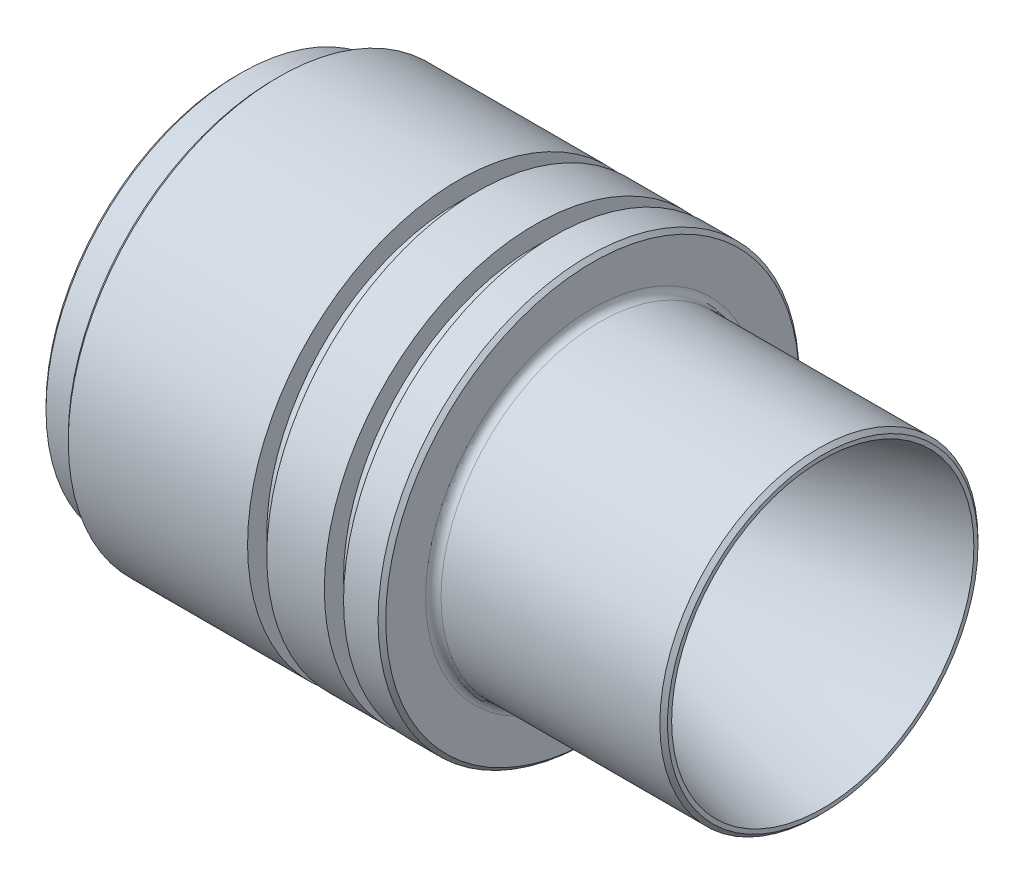
ISO-10303-21;
HEADER;
FILE_DESCRIPTION(('STEP AP214'),'2;1');
FILE_NAME('part.step','',(''),(''),'','','');
FILE_SCHEMA(('AUTOMOTIVE_DESIGN { 1 0 10303 214 1 1 1 1 }'));
ENDSEC;
DATA;
#1=APPLICATION_CONTEXT('core data for automotive mechanical design processes');
#2=APPLICATION_PROTOCOL_DEFINITION('international standard','automotive_design',2000,#1);
#3=PRODUCT_CONTEXT('',#1,'mechanical');
#4=PRODUCT('Part','Part','',(#3));
#5=PRODUCT_RELATED_PRODUCT_CATEGORY('part','',(#4));
#6=PRODUCT_DEFINITION_FORMATION('','',#4);
#7=PRODUCT_DEFINITION_CONTEXT('part definition',#1,'design');
#8=PRODUCT_DEFINITION('design','',#6,#7);
#9=PRODUCT_DEFINITION_SHAPE('','',#8);
#10=(LENGTH_UNIT() NAMED_UNIT(*) SI_UNIT(.MILLI.,.METRE.));
#11=(NAMED_UNIT(*) PLANE_ANGLE_UNIT() SI_UNIT($,.RADIAN.));
#12=(NAMED_UNIT(*) SI_UNIT($,.STERADIAN.) SOLID_ANGLE_UNIT());
#13=UNCERTAINTY_MEASURE_WITH_UNIT(LENGTH_MEASURE(1.E-05),#10,'distance_accuracy_value','');
#14=(GEOMETRIC_REPRESENTATION_CONTEXT(3) GLOBAL_UNCERTAINTY_ASSIGNED_CONTEXT((#13)) GLOBAL_UNIT_ASSIGNED_CONTEXT((#10,
#11,#12)) REPRESENTATION_CONTEXT('',''));
#15=CARTESIAN_POINT('',(0.,0.,0.));
#16=DIRECTION('',(0.,0.,1.));
#17=DIRECTION('',(1.,0.,0.));
#18=AXIS2_PLACEMENT_3D('',#15,#16,#17);
#19=CARTESIAN_POINT('',(48444.9309471186,-998987.534881036,4.14945855453652E-12));
#20=CARTESIAN_POINT('',(-29010.8121626959,999604.894565104,5.27355936696949E-13));
#21=CARTESIAN_POINT('',(9933.79310329496,-1000108.68715124,2.35228503342455E-12));
#22=B_SPLINE_CURVE_WITH_KNOTS('',2,(#19,#20,#21),.UNSPECIFIED.,.F.,.F.,(3,3),(0.,1.),.UNSPECIFIED.);
#23=CARTESIAN_POINT('',(-88.9899999999999,0.,0.));
#24=DIRECTION('',(-1.,0.,0.));
#25=AXIS1_PLACEMENT('',#23,#24);
#26=SURFACE_OF_REVOLUTION('',#22,#25);
#27=CARTESIAN_POINT('',(9.77794269744381,0.,0.));
#28=DIRECTION('',(-1.,0.,0.));
#29=DIRECTION('',(0.,0.,1.));
#30=AXIS2_PLACEMENT_3D('',#27,#28,#29);
#31=CIRCLE('',#30,8.80937168716728);
#32=CARTESIAN_POINT('',(9.77794269744381,0.,8.80937168716729));
#33=VERTEX_POINT('',#32);
#34=EDGE_CURVE('E112',#33,#33,#31,.T.);
#35=ORIENTED_EDGE('',*,*,#34,.T.);
#36=EDGE_LOOP('',(#35));
#37=FACE_BOUND('',#36,.T.);
#38=CARTESIAN_POINT('',(58.8685780406379,0.,0.));
#39=DIRECTION('',(-1.,0.,0.));
#40=DIRECTION('',(0.,0.,1.));
#41=AXIS2_PLACEMENT_3D('',#38,#39,#40);
#42=CIRCLE('',#41,25.);
#43=CARTESIAN_POINT('',(58.8685780406379,0.,25.));
#44=VERTEX_POINT('',#43);
#45=EDGE_CURVE('E70',#44,#44,#42,.T.);
#46=ORIENTED_EDGE('',*,*,#45,.F.);
#47=EDGE_LOOP('',(#46));
#48=FACE_BOUND('',#47,.T.);
#49=ADVANCED_FACE('F32',(#37,#48),#26,.F.);
#50=CARTESIAN_POINT('',(58.8685780406379,0.,0.));
#51=DIRECTION('',(1.,0.,0.));
#52=DIRECTION('',(0.,0.,-1.));
#53=AXIS2_PLACEMENT_3D('',#50,#51,#52);
#54=PLANE('',#53);
#55=CARTESIAN_POINT('',(58.8685780406379,0.,0.));
#56=DIRECTION('',(1.,0.,0.));
#57=DIRECTION('',(0.,0.,-1.));
#58=AXIS2_PLACEMENT_3D('',#55,#56,#57);
#59=CIRCLE('',#58,25.6794);
#60=CARTESIAN_POINT('',(58.8685780406379,0.,-25.6794));
#61=VERTEX_POINT('',#60);
#62=EDGE_CURVE('E64',#61,#61,#59,.T.);
#63=ORIENTED_EDGE('',*,*,#62,.T.);
#64=EDGE_LOOP('',(#63));
#65=FACE_BOUND('',#64,.T.);
#66=ORIENTED_EDGE('',*,*,#45,.T.);
#67=EDGE_LOOP('',(#66));
#68=FACE_BOUND('',#67,.T.);
#69=ADVANCED_FACE('F125',(#65,#68),#54,.T.);
#70=CARTESIAN_POINT('',(-88.9899999999999,0.,0.));
#71=DIRECTION('',(-1.,0.,0.));
#72=DIRECTION('',(0.,0.,1.));
#73=AXIS2_PLACEMENT_3D('',#70,#71,#72);
#74=CYLINDRICAL_SURFACE('',#73,26.3144);
#75=CARTESIAN_POINT('',(22.038578040638,0.,0.));
#76=DIRECTION('',(1.,0.,0.));
#77=DIRECTION('',(0.,0.,-1.));
#78=AXIS2_PLACEMENT_3D('',#75,#76,#77);
#79=CIRCLE('',#78,26.3144);
#80=CARTESIAN_POINT('',(22.038578040638,0.,-26.3144));
#81=VERTEX_POINT('',#80);
#82=EDGE_CURVE('E10',#81,#81,#79,.T.);
#83=ORIENTED_EDGE('',*,*,#82,.T.);
#84=EDGE_LOOP('',(#83));
#85=FACE_BOUND('',#84,.T.);
#86=CARTESIAN_POINT('',(58.233578040638,0.,0.));
#87=DIRECTION('',(1.,0.,0.));
#88=DIRECTION('',(0.,0.,-1.));
#89=AXIS2_PLACEMENT_3D('',#86,#87,#88);
#90=CIRCLE('',#89,26.3144);
#91=CARTESIAN_POINT('',(58.233578040638,0.,-26.3144));
#92=VERTEX_POINT('',#91);
#93=EDGE_CURVE('E67',#92,#92,#90,.F.);
#94=ORIENTED_EDGE('',*,*,#93,.T.);
#95=EDGE_LOOP('',(#94));
#96=FACE_BOUND('',#95,.T.);
#97=ADVANCED_FACE('F217',(#85,#96),#74,.T.);
#98=CARTESIAN_POINT('',(20.7685780406379,0.,0.));
#99=DIRECTION('',(1.,0.,0.));
#100=DIRECTION('',(0.,0.,-1.));
#101=AXIS2_PLACEMENT_3D('',#98,#99,#100);
#102=PLANE('',#101);
#103=CARTESIAN_POINT('',(20.7685780406379,0.,0.));
#104=DIRECTION('',(1.,0.,0.));
#105=DIRECTION('',(0.,0.,-1.));
#106=AXIS2_PLACEMENT_3D('',#103,#104,#105);
#107=CIRCLE('',#106,27.5844);
#108=CARTESIAN_POINT('',(20.7685780406379,0.,-27.5844));
#109=VERTEX_POINT('',#108);
#110=EDGE_CURVE('E39',#109,#109,#107,.F.);
#111=ORIENTED_EDGE('',*,*,#110,.T.);
#112=EDGE_LOOP('',(#111));
#113=FACE_BOUND('',#112,.T.);
#114=CARTESIAN_POINT('',(20.7685780406379,0.,0.));
#115=DIRECTION('',(1.,0.,0.));
#116=DIRECTION('',(0.,0.,-1.));
#117=AXIS2_PLACEMENT_3D('',#114,#115,#116);
#118=CIRCLE('',#117,34.1884);
#119=CARTESIAN_POINT('',(20.7685780406379,0.,-34.1884));
#120=VERTEX_POINT('',#119);
#121=EDGE_CURVE('E58',#120,#120,#118,.T.);
#122=ORIENTED_EDGE('',*,*,#121,.T.);
#123=EDGE_LOOP('',(#122));
#124=FACE_BOUND('',#123,.T.);
#125=ADVANCED_FACE('F214',(#113,#124),#102,.T.);
#126=CARTESIAN_POINT('',(-88.9899999999999,0.,0.));
#127=DIRECTION('',(-1.,0.,0.));
#128=DIRECTION('',(0.,0.,1.));
#129=AXIS2_PLACEMENT_3D('',#126,#127,#128);
#130=CYLINDRICAL_SURFACE('',#129,34.8234);
#131=CARTESIAN_POINT('',(20.133578040638,0.,0.));
#132=DIRECTION('',(1.,0.,0.));
#133=DIRECTION('',(0.,0.,-1.));
#134=AXIS2_PLACEMENT_3D('',#131,#132,#133);
#135=CIRCLE('',#134,34.8234);
#136=CARTESIAN_POINT('',(20.133578040638,0.,-34.8234));
#137=VERTEX_POINT('',#136);
#138=EDGE_CURVE('E61',#137,#137,#135,.F.);
#139=ORIENTED_EDGE('',*,*,#138,.T.);
#140=EDGE_LOOP('',(#139));
#141=FACE_BOUND('',#140,.T.);
#142=CARTESIAN_POINT('',(14.4185780406381,0.,0.));
#143=DIRECTION('',(-1.,0.,0.));
#144=DIRECTION('',(0.,0.,1.));
#145=AXIS2_PLACEMENT_3D('',#142,#143,#144);
#146=CIRCLE('',#145,34.8234);
#147=CARTESIAN_POINT('',(14.4185780406381,0.,34.8234));
#148=VERTEX_POINT('',#147);
#149=EDGE_CURVE('E73',#148,#148,#146,.T.);
#150=ORIENTED_EDGE('',*,*,#149,.F.);
#151=EDGE_LOOP('',(#150));
#152=FACE_BOUND('',#151,.T.);
#153=ADVANCED_FACE('F210',(#141,#152),#130,.T.);
#154=CARTESIAN_POINT('',(14.4185780406381,0.,0.));
#155=DIRECTION('',(-1.,0.,0.));
#156=DIRECTION('',(0.,0.,1.));
#157=AXIS2_PLACEMENT_3D('',#154,#155,#156);
#158=PLANE('',#157);
#159=ORIENTED_EDGE('',*,*,#149,.T.);
#160=EDGE_LOOP('',(#159));
#161=FACE_BOUND('',#160,.T.);
#162=CARTESIAN_POINT('',(14.4185780406381,0.,0.));
#163=DIRECTION('',(-1.,0.,0.));
#164=DIRECTION('',(0.,0.,1.));
#165=AXIS2_PLACEMENT_3D('',#162,#163,#164);
#166=CIRCLE('',#165,31.6484);
#167=CARTESIAN_POINT('',(14.4185780406381,0.,31.6484));
#168=VERTEX_POINT('',#167);
#169=EDGE_CURVE('E76',#168,#168,#166,.T.);
#170=ORIENTED_EDGE('',*,*,#169,.F.);
#171=EDGE_LOOP('',(#170));
#172=FACE_BOUND('',#171,.T.);
#173=ADVANCED_FACE('F206',(#161,#172),#158,.T.);
#174=CARTESIAN_POINT('',(-88.9899999999999,0.,0.));
#175=DIRECTION('',(-1.,0.,0.));
#176=DIRECTION('',(0.,0.,1.));
#177=AXIS2_PLACEMENT_3D('',#174,#175,#176);
#178=CYLINDRICAL_SURFACE('',#177,31.6484);
#179=ORIENTED_EDGE('',*,*,#169,.T.);
#180=EDGE_LOOP('',(#179));
#181=FACE_BOUND('',#180,.T.);
#182=CARTESIAN_POINT('',(11.2435780406379,0.,0.));
#183=DIRECTION('',(-1.,0.,0.));
#184=DIRECTION('',(0.,0.,1.));
#185=AXIS2_PLACEMENT_3D('',#182,#183,#184);
#186=CIRCLE('',#185,31.6484);
#187=CARTESIAN_POINT('',(11.2435780406379,0.,31.6484));
#188=VERTEX_POINT('',#187);
#189=EDGE_CURVE('E79',#188,#188,#186,.T.);
#190=ORIENTED_EDGE('',*,*,#189,.F.);
#191=EDGE_LOOP('',(#190));
#192=FACE_BOUND('',#191,.T.);
#193=ADVANCED_FACE('F202',(#181,#192),#178,.T.);
#194=CARTESIAN_POINT('',(11.2435780406379,0.,0.));
#195=DIRECTION('',(1.,0.,0.));
#196=DIRECTION('',(0.,0.,-1.));
#197=AXIS2_PLACEMENT_3D('',#194,#195,#196);
#198=PLANE('',#197);
#199=ORIENTED_EDGE('',*,*,#189,.T.);
#200=EDGE_LOOP('',(#199));
#201=FACE_BOUND('',#200,.T.);
#202=CARTESIAN_POINT('',(11.2435780406379,0.,0.));
#203=DIRECTION('',(-1.,0.,0.));
#204=DIRECTION('',(0.,0.,1.));
#205=AXIS2_PLACEMENT_3D('',#202,#203,#204);
#206=CIRCLE('',#205,34.8234);
#207=CARTESIAN_POINT('',(11.2435780406379,0.,34.8234));
#208=VERTEX_POINT('',#207);
#209=EDGE_CURVE('E82',#208,#208,#206,.T.);
#210=ORIENTED_EDGE('',*,*,#209,.F.);
#211=EDGE_LOOP('',(#210));
#212=FACE_BOUND('',#211,.T.);
#213=ADVANCED_FACE('F198',(#201,#212),#198,.T.);
#214=CARTESIAN_POINT('',(-88.9899999999999,0.,0.));
#215=DIRECTION('',(-1.,0.,0.));
#216=DIRECTION('',(0.,0.,1.));
#217=AXIS2_PLACEMENT_3D('',#214,#215,#216);
#218=CYLINDRICAL_SURFACE('',#217,34.8234);
#219=ORIENTED_EDGE('',*,*,#209,.T.);
#220=EDGE_LOOP('',(#219));
#221=FACE_BOUND('',#220,.T.);
#222=CARTESIAN_POINT('',(1.71857804063791,0.,0.));
#223=DIRECTION('',(-1.,0.,0.));
#224=DIRECTION('',(0.,0.,1.));
#225=AXIS2_PLACEMENT_3D('',#222,#223,#224);
#226=CIRCLE('',#225,34.8234);
#227=CARTESIAN_POINT('',(1.71857804063791,0.,34.8234));
#228=VERTEX_POINT('',#227);
#229=EDGE_CURVE('E85',#228,#228,#226,.T.);
#230=ORIENTED_EDGE('',*,*,#229,.F.);
#231=EDGE_LOOP('',(#230));
#232=FACE_BOUND('',#231,.T.);
#233=ADVANCED_FACE('F194',(#221,#232),#218,.T.);
#234=CARTESIAN_POINT('',(1.71857804063813,0.,0.));
#235=DIRECTION('',(-1.,0.,0.));
#236=DIRECTION('',(0.,0.,1.));
#237=AXIS2_PLACEMENT_3D('',#234,#235,#236);
#238=PLANE('',#237);
#239=ORIENTED_EDGE('',*,*,#229,.T.);
#240=EDGE_LOOP('',(#239));
#241=FACE_BOUND('',#240,.T.);
#242=CARTESIAN_POINT('',(1.71857804063791,0.,0.));
#243=DIRECTION('',(-1.,0.,0.));
#244=DIRECTION('',(0.,0.,1.));
#245=AXIS2_PLACEMENT_3D('',#242,#243,#244);
#246=CIRCLE('',#245,31.6484);
#247=CARTESIAN_POINT('',(1.71857804063791,0.,31.6484));
#248=VERTEX_POINT('',#247);
#249=EDGE_CURVE('E88',#248,#248,#246,.T.);
#250=ORIENTED_EDGE('',*,*,#249,.F.);
#251=EDGE_LOOP('',(#250));
#252=FACE_BOUND('',#251,.T.);
#253=ADVANCED_FACE('F190',(#241,#252),#238,.T.);
#254=CARTESIAN_POINT('',(-88.9899999999999,0.,0.));
#255=DIRECTION('',(-1.,0.,0.));
#256=DIRECTION('',(0.,0.,1.));
#257=AXIS2_PLACEMENT_3D('',#254,#255,#256);
#258=CYLINDRICAL_SURFACE('',#257,31.6484);
#259=ORIENTED_EDGE('',*,*,#249,.T.);
#260=EDGE_LOOP('',(#259));
#261=FACE_BOUND('',#260,.T.);
#262=CARTESIAN_POINT('',(-1.45642195936202,0.,0.));
#263=DIRECTION('',(-1.,0.,0.));
#264=DIRECTION('',(0.,0.,1.));
#265=AXIS2_PLACEMENT_3D('',#262,#263,#264);
#266=CIRCLE('',#265,31.6484);
#267=CARTESIAN_POINT('',(-1.45642195936202,0.,31.6484));
#268=VERTEX_POINT('',#267);
#269=EDGE_CURVE('E91',#268,#268,#266,.T.);
#270=ORIENTED_EDGE('',*,*,#269,.F.);
#271=EDGE_LOOP('',(#270));
#272=FACE_BOUND('',#271,.T.);
#273=ADVANCED_FACE('F186',(#261,#272),#258,.T.);
#274=CARTESIAN_POINT('',(-1.45642195936202,0.,0.));
#275=DIRECTION('',(1.,0.,0.));
#276=DIRECTION('',(0.,0.,-1.));
#277=AXIS2_PLACEMENT_3D('',#274,#275,#276);
#278=PLANE('',#277);
#279=ORIENTED_EDGE('',*,*,#269,.T.);
#280=EDGE_LOOP('',(#279));
#281=FACE_BOUND('',#280,.T.);
#282=CARTESIAN_POINT('',(-1.45642195936202,0.,0.));
#283=DIRECTION('',(-1.,0.,0.));
#284=DIRECTION('',(0.,0.,1.));
#285=AXIS2_PLACEMENT_3D('',#282,#283,#284);
#286=CIRCLE('',#285,34.8234);
#287=CARTESIAN_POINT('',(-1.45642195936202,0.,34.8234));
#288=VERTEX_POINT('',#287);
#289=EDGE_CURVE('E94',#288,#288,#286,.T.);
#290=ORIENTED_EDGE('',*,*,#289,.F.);
#291=EDGE_LOOP('',(#290));
#292=FACE_BOUND('',#291,.T.);
#293=ADVANCED_FACE('F182',(#281,#292),#278,.T.);
#294=CARTESIAN_POINT('',(-88.9899999999999,0.,0.));
#295=DIRECTION('',(-1.,0.,0.));
#296=DIRECTION('',(0.,0.,1.));
#297=AXIS2_PLACEMENT_3D('',#294,#295,#296);
#298=CYLINDRICAL_SURFACE('',#297,34.8234);
#299=CARTESIAN_POINT('',(-31.115,0.,0.));
#300=DIRECTION('',(-1.,0.,0.));
#301=DIRECTION('',(0.,0.,1.));
#302=AXIS2_PLACEMENT_3D('',#299,#300,#301);
#303=CIRCLE('',#302,34.8234);
#304=CARTESIAN_POINT('',(-31.115,0.,34.8234));
#305=VERTEX_POINT('',#304);
#306=EDGE_CURVE('E52',#305,#305,#303,.F.);
#307=ORIENTED_EDGE('',*,*,#306,.T.);
#308=EDGE_LOOP('',(#307));
#309=FACE_BOUND('',#308,.T.);
#310=ORIENTED_EDGE('',*,*,#289,.T.);
#311=EDGE_LOOP('',(#310));
#312=FACE_BOUND('',#311,.T.);
#313=ADVANCED_FACE('F178',(#309,#312),#298,.T.);
#314=CARTESIAN_POINT('',(-31.7499999999999,0.,0.));
#315=DIRECTION('',(-1.,0.,0.));
#316=DIRECTION('',(0.,0.,1.));
#317=AXIS2_PLACEMENT_3D('',#314,#315,#316);
#318=PLANE('',#317);
#319=CARTESIAN_POINT('',(-31.7499999999999,0.,0.));
#320=DIRECTION('',(-1.,0.,0.));
#321=DIRECTION('',(0.,0.,1.));
#322=AXIS2_PLACEMENT_3D('',#319,#320,#321);
#323=CIRCLE('',#322,34.1884);
#324=CARTESIAN_POINT('',(-31.7499999999999,0.,34.1884));
#325=VERTEX_POINT('',#324);
#326=EDGE_CURVE('E55',#325,#325,#323,.T.);
#327=ORIENTED_EDGE('',*,*,#326,.T.);
#328=EDGE_LOOP('',(#327));
#329=FACE_BOUND('',#328,.T.);
#330=CARTESIAN_POINT('',(-31.7499999999999,0.,0.));
#331=DIRECTION('',(-1.,0.,0.));
#332=DIRECTION('',(0.,0.,1.));
#333=AXIS2_PLACEMENT_3D('',#330,#331,#332);
#334=CIRCLE('',#333,32.1564);
#335=CARTESIAN_POINT('',(-31.7499999999999,0.,32.1564));
#336=VERTEX_POINT('',#335);
#337=EDGE_CURVE('E97',#336,#336,#334,.T.);
#338=ORIENTED_EDGE('',*,*,#337,.F.);
#339=EDGE_LOOP('',(#338));
#340=FACE_BOUND('',#339,.T.);
#341=ADVANCED_FACE('F174',(#329,#340),#318,.T.);
#342=CARTESIAN_POINT('',(-88.9899999999999,0.,0.));
#343=DIRECTION('',(-1.,0.,0.));
#344=DIRECTION('',(0.,0.,1.));
#345=AXIS2_PLACEMENT_3D('',#342,#343,#344);
#346=CYLINDRICAL_SURFACE('',#345,32.1564);
#347=CARTESIAN_POINT('',(-37.4650000000001,0.,0.));
#348=DIRECTION('',(1.,0.,0.));
#349=DIRECTION('',(0.,0.,-1.));
#350=AXIS2_PLACEMENT_3D('',#347,#348,#349);
#351=CIRCLE('',#350,32.1564);
#352=CARTESIAN_POINT('',(-37.4650000000001,0.,-32.1564));
#353=VERTEX_POINT('',#352);
#354=EDGE_CURVE('E43',#353,#353,#351,.T.);
#355=ORIENTED_EDGE('',*,*,#354,.T.);
#356=EDGE_LOOP('',(#355));
#357=FACE_BOUND('',#356,.T.);
#358=ORIENTED_EDGE('',*,*,#337,.T.);
#359=EDGE_LOOP('',(#358));
#360=FACE_BOUND('',#359,.T.);
#361=ADVANCED_FACE('F155',(#357,#360),#346,.T.);
#362=CARTESIAN_POINT('',(-38.1,0.,0.));
#363=DIRECTION('',(1.,0.,0.));
#364=DIRECTION('',(0.,0.,-1.));
#365=AXIS2_PLACEMENT_3D('',#362,#363,#364);
#366=PLANE('',#365);
#367=CARTESIAN_POINT('',(-38.1,0.,0.));
#368=DIRECTION('',(1.,0.,0.));
#369=DIRECTION('',(0.,0.,-1.));
#370=AXIS2_PLACEMENT_3D('',#367,#368,#369);
#371=CIRCLE('',#370,31.5214);
#372=CARTESIAN_POINT('',(-38.1,0.,-31.5214));
#373=VERTEX_POINT('',#372);
#374=EDGE_CURVE('E47',#373,#373,#371,.F.);
#375=ORIENTED_EDGE('',*,*,#374,.T.);
#376=EDGE_LOOP('',(#375));
#377=FACE_BOUND('',#376,.T.);
#378=CARTESIAN_POINT('',(-38.1,0.,0.));
#379=DIRECTION('',(-1.,0.,0.));
#380=DIRECTION('',(0.,0.,1.));
#381=AXIS2_PLACEMENT_3D('',#378,#379,#380);
#382=CIRCLE('',#381,28.4734);
#383=CARTESIAN_POINT('',(-38.1,0.,28.4734));
#384=VERTEX_POINT('',#383);
#385=EDGE_CURVE('E100',#384,#384,#382,.T.);
#386=ORIENTED_EDGE('',*,*,#385,.F.);
#387=EDGE_LOOP('',(#386));
#388=FACE_BOUND('',#387,.T.);
#389=ADVANCED_FACE('F151',(#377,#388),#366,.F.);
#390=CARTESIAN_POINT('',(-88.9899999999999,0.,0.));
#391=DIRECTION('',(-1.,0.,0.));
#392=DIRECTION('',(0.,0.,1.));
#393=AXIS2_PLACEMENT_3D('',#390,#391,#392);
#394=CYLINDRICAL_SURFACE('',#393,28.4734);
#395=CARTESIAN_POINT('',(-28.8659323495526,0.,0.));
#396=DIRECTION('',(-1.,0.,0.));
#397=DIRECTION('',(0.,0.,1.));
#398=AXIS2_PLACEMENT_3D('',#395,#396,#397);
#399=CIRCLE('',#398,28.4734);
#400=CARTESIAN_POINT('',(-28.8659323495526,0.,28.4734));
#401=VERTEX_POINT('',#400);
#402=EDGE_CURVE('E103',#401,#401,#399,.T.);
#403=ORIENTED_EDGE('',*,*,#402,.F.);
#404=EDGE_LOOP('',(#403));
#405=FACE_BOUND('',#404,.T.);
#406=ORIENTED_EDGE('',*,*,#385,.T.);
#407=EDGE_LOOP('',(#406));
#408=FACE_BOUND('',#407,.T.);
#409=ADVANCED_FACE('F154',(#405,#408),#394,.F.);
#410=CARTESIAN_POINT('',(-28.8659323495526,0.,0.));
#411=DIRECTION('',(-1.,0.,0.));
#412=DIRECTION('',(0.,0.,1.));
#413=AXIS2_PLACEMENT_3D('',#410,#411,#412);
#414=DEGENERATE_TOROIDAL_SURFACE('',#413,3.54555699747298,32.018956997473,.F.);
#415=ORIENTED_EDGE('',*,*,#402,.T.);
#416=EDGE_LOOP('',(#415));
#417=FACE_BOUND('',#416,.T.);
#418=CARTESIAN_POINT('',(-2.19593234955262,0.,0.));
#419=DIRECTION('',(-1.,0.,0.));
#420=DIRECTION('',(0.,0.,1.));
#421=AXIS2_PLACEMENT_3D('',#418,#419,#420);
#422=CIRCLE('',#421,14.1723635127343);
#423=CARTESIAN_POINT('',(-2.19593234955262,0.,14.1723635127343));
#424=VERTEX_POINT('',#423);
#425=EDGE_CURVE('E106',#424,#424,#422,.T.);
#426=ORIENTED_EDGE('',*,*,#425,.F.);
#427=EDGE_LOOP('',(#426));
#428=FACE_BOUND('',#427,.T.);
#429=ADVANCED_FACE('F160',(#417,#428),#414,.T.);
#430=CARTESIAN_POINT('',(8.38245719720021,0.,0.));
#431=DIRECTION('',(-1.,0.,0.));
#432=DIRECTION('',(0.,0.,1.));
#433=AXIS2_PLACEMENT_3D('',#430,#431,#432);
#434=TOROIDAL_SURFACE('',#433,21.2,12.7);
#435=ORIENTED_EDGE('',*,*,#425,.T.);
#436=EDGE_LOOP('',(#435));
#437=FACE_BOUND('',#436,.T.);
#438=CARTESIAN_POINT('',(8.38245719720021,0.,0.));
#439=DIRECTION('',(-1.,0.,0.));
#440=DIRECTION('',(0.,0.,1.));
#441=AXIS2_PLACEMENT_3D('',#438,#439,#440);
#442=CIRCLE('',#441,8.49999999997605);
#443=CARTESIAN_POINT('',(8.38245719720021,0.,8.49999999997605));
#444=VERTEX_POINT('',#443);
#445=EDGE_CURVE('E109',#444,#444,#442,.T.);
#446=ORIENTED_EDGE('',*,*,#445,.F.);
#447=EDGE_LOOP('',(#446));
#448=FACE_BOUND('',#447,.T.);
#449=ADVANCED_FACE('F166',(#437,#448),#434,.T.);
#450=CARTESIAN_POINT('',(8.38245719720021,0.,0.));
#451=DIRECTION('',(-1.,0.,0.));
#452=DIRECTION('',(0.,0.,1.));
#453=AXIS2_PLACEMENT_3D('',#450,#451,#452);
#454=TOROIDAL_SURFACE('',#453,11.802,3.30200000002395);
#455=ORIENTED_EDGE('',*,*,#34,.F.);
#456=EDGE_LOOP('',(#455));
#457=FACE_BOUND('',#456,.T.);
#458=ORIENTED_EDGE('',*,*,#445,.T.);
#459=EDGE_LOOP('',(#458));
#460=FACE_BOUND('',#459,.T.);
#461=ADVANCED_FACE('F132',(#457,#460),#454,.T.);
#462=CARTESIAN_POINT('',(58.233578040638,0.,0.));
#463=DIRECTION('',(-1.,0.,0.));
#464=DIRECTION('',(0.,0.,1.));
#465=AXIS2_PLACEMENT_3D('',#462,#463,#464);
#466=CONICAL_SURFACE('',#465,26.3144,0.785398163397454);
#467=ORIENTED_EDGE('',*,*,#62,.F.);
#468=EDGE_LOOP('',(#467));
#469=FACE_BOUND('',#468,.T.);
#470=ORIENTED_EDGE('',*,*,#93,.F.);
#471=EDGE_LOOP('',(#470));
#472=FACE_BOUND('',#471,.T.);
#473=ADVANCED_FACE('F128',(#469,#472),#466,.T.);
#474=CARTESIAN_POINT('',(20.133578040638,0.,0.));
#475=DIRECTION('',(-1.,0.,0.));
#476=DIRECTION('',(0.,0.,1.));
#477=AXIS2_PLACEMENT_3D('',#474,#475,#476);
#478=CONICAL_SURFACE('',#477,34.8234,0.785398163397454);
#479=ORIENTED_EDGE('',*,*,#121,.F.);
#480=EDGE_LOOP('',(#479));
#481=FACE_BOUND('',#480,.T.);
#482=ORIENTED_EDGE('',*,*,#138,.F.);
#483=EDGE_LOOP('',(#482));
#484=FACE_BOUND('',#483,.T.);
#485=ADVANCED_FACE('F131',(#481,#484),#478,.T.);
#486=CARTESIAN_POINT('',(-31.7499999999999,0.,0.));
#487=DIRECTION('',(1.,0.,0.));
#488=DIRECTION('',(0.,0.,-1.));
#489=AXIS2_PLACEMENT_3D('',#486,#487,#488);
#490=CONICAL_SURFACE('',#489,34.1884,0.785398163397459);
#491=ORIENTED_EDGE('',*,*,#306,.F.);
#492=EDGE_LOOP('',(#491));
#493=FACE_BOUND('',#492,.T.);
#494=ORIENTED_EDGE('',*,*,#326,.F.);
#495=EDGE_LOOP('',(#494));
#496=FACE_BOUND('',#495,.T.);
#497=ADVANCED_FACE('F136',(#493,#496),#490,.T.);
#498=CARTESIAN_POINT('',(-38.1,0.,0.));
#499=DIRECTION('',(1.,0.,0.));
#500=DIRECTION('',(0.,0.,-1.));
#501=AXIS2_PLACEMENT_3D('',#498,#499,#500);
#502=CONICAL_SURFACE('',#501,31.5214,0.785398163397443);
#503=ORIENTED_EDGE('',*,*,#354,.F.);
#504=EDGE_LOOP('',(#503));
#505=FACE_BOUND('',#504,.T.);
#506=ORIENTED_EDGE('',*,*,#374,.F.);
#507=EDGE_LOOP('',(#506));
#508=FACE_BOUND('',#507,.T.);
#509=ADVANCED_FACE('F139',(#505,#508),#502,.T.);
#510=CARTESIAN_POINT('',(22.038578040638,0.,0.));
#511=DIRECTION('',(1.,0.,0.));
#512=DIRECTION('',(0.,0.,-1.));
#513=AXIS2_PLACEMENT_3D('',#510,#511,#512);
#514=TOROIDAL_SURFACE('',#513,27.5844,1.27);
#515=ORIENTED_EDGE('',*,*,#82,.F.);
#516=EDGE_LOOP('',(#515));
#517=FACE_BOUND('',#516,.T.);
#518=ORIENTED_EDGE('',*,*,#110,.F.);
#519=EDGE_LOOP('',(#518));
#520=FACE_BOUND('',#519,.T.);
#521=ADVANCED_FACE('F34',(#517,#520),#514,.F.);
#522=CLOSED_SHELL('',(#49,#69,#97,#125,#153,#173,#193,#213,#233,#253,#273,#293,#313,#341,#361,
#389,#409,#429,#449,#461,#473,#485,#497,#509,#521));
#523=MANIFOLD_SOLID_BREP('B2',#522);
#524=ADVANCED_BREP_SHAPE_REPRESENTATION('',(#18,#523),#14);
#525=SHAPE_DEFINITION_REPRESENTATION(#9,#524);
ENDSEC;
END-ISO-10303-21;
